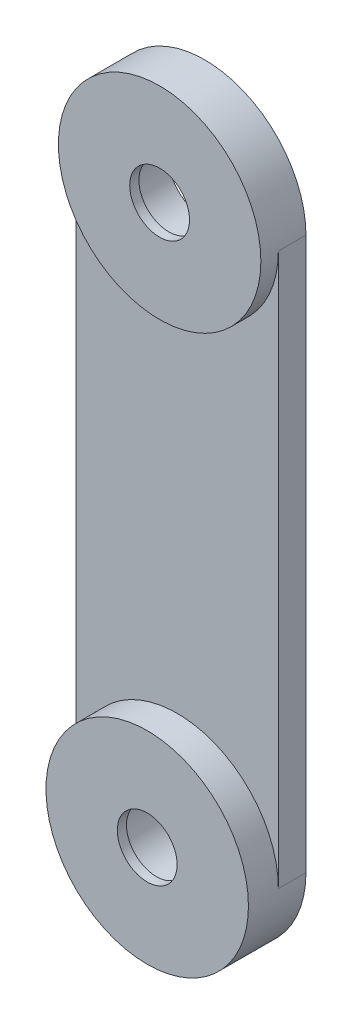
ISO-10303-21;
HEADER;
FILE_DESCRIPTION(('STEP AP214'),'2;1');
FILE_NAME('part.step','',(''),(''),'','','');
FILE_SCHEMA(('AUTOMOTIVE_DESIGN { 1 0 10303 214 1 1 1 1 }'));
ENDSEC;
DATA;
#1=APPLICATION_CONTEXT('core data for automotive mechanical design processes');
#2=APPLICATION_PROTOCOL_DEFINITION('international standard','automotive_design',2000,#1);
#3=PRODUCT_CONTEXT('',#1,'mechanical');
#4=PRODUCT('Part','Part','',(#3));
#5=PRODUCT_RELATED_PRODUCT_CATEGORY('part','',(#4));
#6=PRODUCT_DEFINITION_FORMATION('','',#4);
#7=PRODUCT_DEFINITION_CONTEXT('part definition',#1,'design');
#8=PRODUCT_DEFINITION('design','',#6,#7);
#9=PRODUCT_DEFINITION_SHAPE('','',#8);
#10=(LENGTH_UNIT() NAMED_UNIT(*) SI_UNIT(.MILLI.,.METRE.));
#11=(NAMED_UNIT(*) PLANE_ANGLE_UNIT() SI_UNIT($,.RADIAN.));
#12=(NAMED_UNIT(*) SI_UNIT($,.STERADIAN.) SOLID_ANGLE_UNIT());
#13=UNCERTAINTY_MEASURE_WITH_UNIT(LENGTH_MEASURE(1.E-05),#10,'distance_accuracy_value','');
#14=(GEOMETRIC_REPRESENTATION_CONTEXT(3) GLOBAL_UNCERTAINTY_ASSIGNED_CONTEXT((#13)) GLOBAL_UNIT_ASSIGNED_CONTEXT((#10,
#11,#12)) REPRESENTATION_CONTEXT('',''));
#15=CARTESIAN_POINT('',(0.,0.,0.));
#16=DIRECTION('',(0.,0.,1.));
#17=DIRECTION('',(1.,0.,0.));
#18=AXIS2_PLACEMENT_3D('',#15,#16,#17);
#19=CARTESIAN_POINT('',(13.3841875105118,-8.42748695585386,0.));
#20=DIRECTION('',(0.,0.,1.));
#21=DIRECTION('',(1.,0.,0.));
#22=AXIS2_PLACEMENT_3D('',#19,#20,#21);
#23=PLANE('',#22);
#24=CARTESIAN_POINT('',(13.3841875105117,-8.42748695585386,0.));
#25=DIRECTION('',(0.,0.,-1.));
#26=DIRECTION('',(-1.,0.,0.));
#27=AXIS2_PLACEMENT_3D('',#24,#25,#26);
#28=CIRCLE('',#27,3.25);
#29=CARTESIAN_POINT('',(10.1341875105117,-8.42748695585386,0.));
#30=VERTEX_POINT('',#29);
#31=EDGE_CURVE('E121',#30,#30,#28,.T.);
#32=ORIENTED_EDGE('',*,*,#31,.T.);
#33=EDGE_LOOP('',(#32));
#34=FACE_BOUND('',#33,.T.);
#35=CARTESIAN_POINT('',(13.3841875105118,-8.42748695585386,0.));
#36=DIRECTION('',(0.,0.,1.));
#37=DIRECTION('',(1.,0.,0.));
#38=AXIS2_PLACEMENT_3D('',#35,#36,#37);
#39=CIRCLE('',#38,11.);
#40=CARTESIAN_POINT('',(24.3841875105118,-8.42748695585386,0.));
#41=VERTEX_POINT('',#40);
#42=EDGE_CURVE('E46',#41,#41,#39,.T.);
#43=ORIENTED_EDGE('',*,*,#42,.T.);
#44=EDGE_LOOP('',(#43));
#45=FACE_BOUND('',#44,.T.);
#46=ADVANCED_FACE('F37',(#34,#45),#23,.T.);
#47=CARTESIAN_POINT('',(13.3841875105118,-8.42748695585386,-35.0126983722081));
#48=DIRECTION('',(0.,0.,1.));
#49=DIRECTION('',(1.,0.,0.));
#50=AXIS2_PLACEMENT_3D('',#47,#48,#49);
#51=CYLINDRICAL_SURFACE('',#50,11.);
#52=ORIENTED_EDGE('',*,*,#42,.F.);
#53=EDGE_LOOP('',(#52));
#54=FACE_BOUND('',#53,.T.);
#55=CARTESIAN_POINT('',(13.3841875105118,-8.42748695585386,-1.90000000000001));
#56=DIRECTION('',(0.,0.,-1.));
#57=DIRECTION('',(-1.,0.,0.));
#58=AXIS2_PLACEMENT_3D('',#55,#56,#57);
#59=CIRCLE('',#58,11.);
#60=CARTESIAN_POINT('',(2.38418751051177,-8.42748695585386,-1.90000000000001));
#61=VERTEX_POINT('',#60);
#62=CARTESIAN_POINT('',(24.3841875105118,-8.42748695585386,-1.90000000000001));
#63=VERTEX_POINT('',#62);
#64=EDGE_CURVE('E12',#61,#63,#59,.F.);
#65=ORIENTED_EDGE('',*,*,#64,.T.);
#66=DIRECTION('',(0.,0.,1.));
#67=VECTOR('',#66,1.);
#68=CARTESIAN_POINT('',(24.3841875105118,-8.42748695585386,-4.90000000000001));
#69=LINE('',#68,#67);
#70=CARTESIAN_POINT('',(24.3841875105118,-8.42748695585386,-4.90000000000001));
#71=VERTEX_POINT('',#70);
#72=EDGE_CURVE('E132',#71,#63,#69,.T.);
#73=ORIENTED_EDGE('',*,*,#72,.F.);
#74=CARTESIAN_POINT('',(13.3841875105118,-8.42748695585386,-4.90000000000001));
#75=DIRECTION('',(0.,0.,-1.));
#76=DIRECTION('',(-1.,0.,0.));
#77=AXIS2_PLACEMENT_3D('',#74,#75,#76);
#78=CIRCLE('',#77,11.);
#79=CARTESIAN_POINT('',(2.38418751051176,-8.42748695585386,-4.90000000000001));
#80=VERTEX_POINT('',#79);
#81=EDGE_CURVE('E91',#80,#71,#78,.T.);
#82=ORIENTED_EDGE('',*,*,#81,.F.);
#83=DIRECTION('',(0.,0.,1.));
#84=VECTOR('',#83,1.);
#85=CARTESIAN_POINT('',(2.38418751051176,-8.42748695585386,-4.90000000000001));
#86=LINE('',#85,#84);
#87=EDGE_CURVE('E53',#80,#61,#86,.T.);
#88=ORIENTED_EDGE('',*,*,#87,.T.);
#89=EDGE_LOOP('',(#65,#73,#82,#88));
#90=FACE_BOUND('',#89,.T.);
#91=ADVANCED_FACE('F39',(#54,#90),#51,.T.);
#92=CARTESIAN_POINT('',(24.3841875105118,-8.42748695585386,-4.90000000000001));
#93=DIRECTION('',(-1.,0.,0.));
#94=DIRECTION('',(0.,0.,1.));
#95=AXIS2_PLACEMENT_3D('',#92,#93,#94);
#96=PLANE('',#95);
#97=DIRECTION('',(0.,-1.,0.));
#98=VECTOR('',#97,1.);
#99=CARTESIAN_POINT('',(24.3841875105118,-8.42748695585386,-1.90000000000001));
#100=LINE('',#99,#98);
#101=CARTESIAN_POINT('',(24.3841875105118,-68.4274869558539,-1.90000000000001));
#102=VERTEX_POINT('',#101);
#103=EDGE_CURVE('E92',#63,#102,#100,.T.);
#104=ORIENTED_EDGE('',*,*,#103,.T.);
#105=DIRECTION('',(0.,0.,1.));
#106=VECTOR('',#105,1.);
#107=CARTESIAN_POINT('',(24.3841875105118,-68.4274869558539,-4.90000000000001));
#108=LINE('',#107,#106);
#109=CARTESIAN_POINT('',(24.3841875105118,-68.4274869558539,-4.90000000000001));
#110=VERTEX_POINT('',#109);
#111=EDGE_CURVE('E99',#110,#102,#108,.T.);
#112=ORIENTED_EDGE('',*,*,#111,.F.);
#113=DIRECTION('',(0.,-1.,0.));
#114=VECTOR('',#113,1.);
#115=CARTESIAN_POINT('',(24.3841875105118,-8.42748695585386,-4.90000000000001));
#116=LINE('',#115,#114);
#117=EDGE_CURVE('E84',#71,#110,#116,.T.);
#118=ORIENTED_EDGE('',*,*,#117,.F.);
#119=ORIENTED_EDGE('',*,*,#72,.T.);
#120=EDGE_LOOP('',(#104,#112,#118,#119));
#121=FACE_BOUND('',#120,.T.);
#122=ADVANCED_FACE('F159',(#121),#96,.F.);
#123=CARTESIAN_POINT('',(13.3841875105118,-68.4274869558539,-4.9));
#124=DIRECTION('',(0.,0.,1.));
#125=DIRECTION('',(1.,0.,0.));
#126=AXIS2_PLACEMENT_3D('',#123,#124,#125);
#127=CYLINDRICAL_SURFACE('',#126,11.);
#128=ORIENTED_EDGE('',*,*,#111,.T.);
#129=CARTESIAN_POINT('',(13.3841875105118,-68.4274869558539,-1.90000000000001));
#130=DIRECTION('',(0.,0.,1.));
#131=DIRECTION('',(1.,0.,0.));
#132=AXIS2_PLACEMENT_3D('',#129,#130,#131);
#133=CIRCLE('',#132,11.);
#134=CARTESIAN_POINT('',(2.38418751051177,-68.4274869558539,-1.90000000000001));
#135=VERTEX_POINT('',#134);
#136=EDGE_CURVE('E76',#102,#135,#133,.T.);
#137=ORIENTED_EDGE('',*,*,#136,.T.);
#138=DIRECTION('',(0.,0.,1.));
#139=VECTOR('',#138,1.);
#140=CARTESIAN_POINT('',(2.38418751051176,-68.4274869558539,-4.9));
#141=LINE('',#140,#139);
#142=CARTESIAN_POINT('',(2.38418751051176,-68.4274869558539,-4.9));
#143=VERTEX_POINT('',#142);
#144=EDGE_CURVE('E95',#143,#135,#141,.T.);
#145=ORIENTED_EDGE('',*,*,#144,.F.);
#146=CARTESIAN_POINT('',(13.3841875105118,-68.4274869558539,-4.9));
#147=DIRECTION('',(0.,0.,-1.));
#148=DIRECTION('',(-1.,0.,0.));
#149=AXIS2_PLACEMENT_3D('',#146,#147,#148);
#150=CIRCLE('',#149,11.);
#151=EDGE_CURVE('E126',#110,#143,#150,.T.);
#152=ORIENTED_EDGE('',*,*,#151,.F.);
#153=EDGE_LOOP('',(#128,#137,#145,#152));
#154=FACE_BOUND('',#153,.T.);
#155=CARTESIAN_POINT('',(13.3841875105118,-68.4274869558539,1.35000000000002));
#156=DIRECTION('',(0.,0.,1.));
#157=DIRECTION('',(0.,-1.,0.));
#158=AXIS2_PLACEMENT_3D('',#155,#156,#157);
#159=CIRCLE('',#158,11.);
#160=CARTESIAN_POINT('',(13.3841875105118,-79.4274869558539,1.35000000000002));
#161=VERTEX_POINT('',#160);
#162=EDGE_CURVE('E104',#161,#161,#159,.T.);
#163=ORIENTED_EDGE('',*,*,#162,.F.);
#164=EDGE_LOOP('',(#163));
#165=FACE_BOUND('',#164,.T.);
#166=ADVANCED_FACE('F102',(#154,#165),#127,.T.);
#167=CARTESIAN_POINT('',(2.38418751051176,-8.42748695585386,-4.90000000000001));
#168=DIRECTION('',(1.,0.,0.));
#169=DIRECTION('',(0.,0.,-1.));
#170=AXIS2_PLACEMENT_3D('',#167,#168,#169);
#171=PLANE('',#170);
#172=DIRECTION('',(0.,1.,0.));
#173=VECTOR('',#172,1.);
#174=CARTESIAN_POINT('',(2.38418751051177,-8.42748695585386,-1.90000000000001));
#175=LINE('',#174,#173);
#176=EDGE_CURVE('E87',#135,#61,#175,.T.);
#177=ORIENTED_EDGE('',*,*,#176,.T.);
#178=ORIENTED_EDGE('',*,*,#87,.F.);
#179=DIRECTION('',(0.,1.,0.));
#180=VECTOR('',#179,1.);
#181=CARTESIAN_POINT('',(2.38418751051176,-8.42748695585386,-4.90000000000001));
#182=LINE('',#181,#180);
#183=EDGE_CURVE('E62',#143,#80,#182,.T.);
#184=ORIENTED_EDGE('',*,*,#183,.F.);
#185=ORIENTED_EDGE('',*,*,#144,.T.);
#186=EDGE_LOOP('',(#177,#178,#184,#185));
#187=FACE_BOUND('',#186,.T.);
#188=ADVANCED_FACE('F96',(#187),#171,.F.);
#189=CARTESIAN_POINT('',(13.3841875105118,-8.42748695585386,-4.90000000000001));
#190=DIRECTION('',(0.,0.,-1.));
#191=DIRECTION('',(-1.,0.,0.));
#192=AXIS2_PLACEMENT_3D('',#189,#190,#191);
#193=PLANE('',#192);
#194=CARTESIAN_POINT('',(13.3841875105117,-68.4274869558537,-4.9));
#195=DIRECTION('',(0.,0.,-1.));
#196=DIRECTION('',(-1.,0.,0.));
#197=AXIS2_PLACEMENT_3D('',#194,#195,#196);
#198=CIRCLE('',#197,4.00000000000001);
#199=CARTESIAN_POINT('',(9.38418751051166,-68.4274869558537,-4.9));
#200=VERTEX_POINT('',#199);
#201=EDGE_CURVE('E111',#200,#200,#198,.T.);
#202=ORIENTED_EDGE('',*,*,#201,.F.);
#203=EDGE_LOOP('',(#202));
#204=FACE_BOUND('',#203,.T.);
#205=CARTESIAN_POINT('',(13.3841875105117,-8.42748695585386,-4.90000000000001));
#206=DIRECTION('',(0.,0.,-1.));
#207=DIRECTION('',(-1.,0.,0.));
#208=AXIS2_PLACEMENT_3D('',#205,#206,#207);
#209=CIRCLE('',#208,4.);
#210=CARTESIAN_POINT('',(9.38418751051175,-8.42748695585386,-4.90000000000001));
#211=VERTEX_POINT('',#210);
#212=EDGE_CURVE('E108',#211,#211,#209,.T.);
#213=ORIENTED_EDGE('',*,*,#212,.F.);
#214=EDGE_LOOP('',(#213));
#215=FACE_BOUND('',#214,.T.);
#216=ORIENTED_EDGE('',*,*,#81,.T.);
#217=ORIENTED_EDGE('',*,*,#117,.T.);
#218=ORIENTED_EDGE('',*,*,#151,.T.);
#219=ORIENTED_EDGE('',*,*,#183,.T.);
#220=EDGE_LOOP('',(#216,#217,#218,#219));
#221=FACE_BOUND('',#220,.T.);
#222=ADVANCED_FACE('F169',(#204,#215,#221),#193,.T.);
#223=CARTESIAN_POINT('',(13.3841875105118,-8.42748695585386,-1.90000000000001));
#224=DIRECTION('',(0.,0.,-1.));
#225=DIRECTION('',(-1.,0.,0.));
#226=AXIS2_PLACEMENT_3D('',#223,#224,#225);
#227=PLANE('',#226);
#228=ORIENTED_EDGE('',*,*,#136,.F.);
#229=ORIENTED_EDGE('',*,*,#103,.F.);
#230=ORIENTED_EDGE('',*,*,#64,.F.);
#231=ORIENTED_EDGE('',*,*,#176,.F.);
#232=EDGE_LOOP('',(#228,#229,#230,#231));
#233=FACE_BOUND('',#232,.T.);
#234=ADVANCED_FACE('F89',(#233),#227,.F.);
#235=CARTESIAN_POINT('',(13.3841875105117,-8.42748695585386,0.));
#236=DIRECTION('',(0.,0.,-1.));
#237=DIRECTION('',(-1.,0.,0.));
#238=AXIS2_PLACEMENT_3D('',#235,#236,#237);
#239=CYLINDRICAL_SURFACE('',#238,3.25);
#240=CARTESIAN_POINT('',(13.3841875105117,-8.42748695585386,-1.));
#241=DIRECTION('',(0.,0.,1.));
#242=DIRECTION('',(1.,0.,0.));
#243=AXIS2_PLACEMENT_3D('',#240,#241,#242);
#244=CIRCLE('',#243,3.25);
#245=CARTESIAN_POINT('',(10.1341875105117,-8.42748695585386,-1.));
#246=VERTEX_POINT('',#245);
#247=EDGE_CURVE('E120',#246,#246,#244,.F.);
#248=CARTESIAN_POINT('',(10.1341875105117,-8.42748695585386,-1.));
#249=CARTESIAN_POINT('',(10.1341875105117,-8.42748695585386,-0.989583333333333));
#250=CARTESIAN_POINT('',(10.1341875105117,-8.42748695585386,-0.979166666666667));
#251=CARTESIAN_POINT('',(10.1341875105117,-8.42748695585386,-0.958333333333333));
#252=CARTESIAN_POINT('',(10.1341875105117,-8.42748695585386,-0.947916666666667));
#253=CARTESIAN_POINT('',(10.1341875105117,-8.42748695585386,-0.927083333333333));
#254=CARTESIAN_POINT('',(10.1341875105117,-8.42748695585386,-0.916666666666666));
#255=CARTESIAN_POINT('',(10.1341875105117,-8.42748695585386,-0.895833333333333));
#256=CARTESIAN_POINT('',(10.1341875105117,-8.42748695585386,-0.885416666666666));
#257=CARTESIAN_POINT('',(10.1341875105117,-8.42748695585386,-0.864583333333333));
#258=CARTESIAN_POINT('',(10.1341875105117,-8.42748695585386,-0.854166666666666));
#259=CARTESIAN_POINT('',(10.1341875105117,-8.42748695585386,-0.833333333333332));
#260=CARTESIAN_POINT('',(10.1341875105117,-8.42748695585386,-0.822916666666666));
#261=CARTESIAN_POINT('',(10.1341875105117,-8.42748695585386,-0.802083333333332));
#262=CARTESIAN_POINT('',(10.1341875105117,-8.42748695585386,-0.791666666666665));
#263=CARTESIAN_POINT('',(10.1341875105117,-8.42748695585386,-0.770833333333332));
#264=CARTESIAN_POINT('',(10.1341875105117,-8.42748695585386,-0.760416666666665));
#265=CARTESIAN_POINT('',(10.1341875105117,-8.42748695585386,-0.739583333333332));
#266=CARTESIAN_POINT('',(10.1341875105117,-8.42748695585386,-0.729166666666665));
#267=CARTESIAN_POINT('',(10.1341875105117,-8.42748695585386,-0.708333333333332));
#268=CARTESIAN_POINT('',(10.1341875105117,-8.42748695585386,-0.697916666666665));
#269=CARTESIAN_POINT('',(10.1341875105117,-8.42748695585386,-0.677083333333331));
#270=CARTESIAN_POINT('',(10.1341875105117,-8.42748695585386,-0.666666666666665));
#271=CARTESIAN_POINT('',(10.1341875105117,-8.42748695585386,-0.645833333333331));
#272=CARTESIAN_POINT('',(10.1341875105117,-8.42748695585386,-0.635416666666664));
#273=CARTESIAN_POINT('',(10.1341875105117,-8.42748695585386,-0.614583333333331));
#274=CARTESIAN_POINT('',(10.1341875105117,-8.42748695585386,-0.604166666666664));
#275=CARTESIAN_POINT('',(10.1341875105117,-8.42748695585386,-0.583333333333331));
#276=CARTESIAN_POINT('',(10.1341875105117,-8.42748695585386,-0.572916666666664));
#277=CARTESIAN_POINT('',(10.1341875105117,-8.42748695585386,-0.552083333333331));
#278=CARTESIAN_POINT('',(10.1341875105117,-8.42748695585386,-0.541666666666664));
#279=CARTESIAN_POINT('',(10.1341875105117,-8.42748695585386,-0.52083333333333));
#280=CARTESIAN_POINT('',(10.1341875105117,-8.42748695585386,-0.510416666666664));
#281=CARTESIAN_POINT('',(10.1341875105117,-8.42748695585386,-0.48958333333333));
#282=CARTESIAN_POINT('',(10.1341875105117,-8.42748695585386,-0.479166666666664));
#283=CARTESIAN_POINT('',(10.1341875105117,-8.42748695585386,-0.45833333333333));
#284=CARTESIAN_POINT('',(10.1341875105117,-8.42748695585386,-0.447916666666663));
#285=CARTESIAN_POINT('',(10.1341875105117,-8.42748695585386,-0.42708333333333));
#286=CARTESIAN_POINT('',(10.1341875105117,-8.42748695585386,-0.416666666666663));
#287=CARTESIAN_POINT('',(10.1341875105117,-8.42748695585386,-0.39583333333333));
#288=CARTESIAN_POINT('',(10.1341875105117,-8.42748695585386,-0.385416666666663));
#289=CARTESIAN_POINT('',(10.1341875105117,-8.42748695585386,-0.364583333333329));
#290=CARTESIAN_POINT('',(10.1341875105117,-8.42748695585386,-0.354166666666663));
#291=CARTESIAN_POINT('',(10.1341875105117,-8.42748695585386,-0.333333333333329));
#292=CARTESIAN_POINT('',(10.1341875105117,-8.42748695585386,-0.322916666666663));
#293=CARTESIAN_POINT('',(10.1341875105117,-8.42748695585386,-0.302083333333329));
#294=CARTESIAN_POINT('',(10.1341875105117,-8.42748695585386,-0.291666666666662));
#295=CARTESIAN_POINT('',(10.1341875105117,-8.42748695585386,-0.270833333333329));
#296=CARTESIAN_POINT('',(10.1341875105117,-8.42748695585386,-0.260416666666662));
#297=CARTESIAN_POINT('',(10.1341875105117,-8.42748695585386,-0.239583333333329));
#298=CARTESIAN_POINT('',(10.1341875105117,-8.42748695585386,-0.229166666666662));
#299=CARTESIAN_POINT('',(10.1341875105117,-8.42748695585386,-0.208333333333328));
#300=CARTESIAN_POINT('',(10.1341875105117,-8.42748695585386,-0.197916666666662));
#301=CARTESIAN_POINT('',(10.1341875105117,-8.42748695585386,-0.177083333333328));
#302=CARTESIAN_POINT('',(10.1341875105117,-8.42748695585386,-0.166666666666662));
#303=CARTESIAN_POINT('',(10.1341875105117,-8.42748695585386,-0.145833333333328));
#304=CARTESIAN_POINT('',(10.1341875105117,-8.42748695585386,-0.135416666666661));
#305=CARTESIAN_POINT('',(10.1341875105117,-8.42748695585386,-0.114583333333328));
#306=CARTESIAN_POINT('',(10.1341875105117,-8.42748695585386,-0.104166666666661));
#307=CARTESIAN_POINT('',(10.1341875105117,-8.42748695585386,-0.0833333333333277));
#308=CARTESIAN_POINT('',(10.1341875105117,-8.42748695585386,-0.0729166666666609));
#309=CARTESIAN_POINT('',(10.1341875105117,-8.42748695585386,-0.0520833333333275));
#310=CARTESIAN_POINT('',(10.1341875105117,-8.42748695585386,-0.0416666666666608));
#311=CARTESIAN_POINT('',(10.1341875105117,-8.42748695585386,-0.0208333333333273));
#312=CARTESIAN_POINT('',(10.1341875105117,-8.42748695585386,-0.0104166666666605));
#313=CARTESIAN_POINT('',(10.1341875105117,-8.42748695585386,0.));
#314=B_SPLINE_CURVE_WITH_KNOTS('',3,(#248,#249,#250,#251,#252,#253,#254,#255,#256,#257,#258,
#259,#260,#261,#262,#263,#264,#265,#266,#267,#268,#269,#270,#271,#272,#273,#274,#275,#276,#277,
#278,#279,#280,#281,#282,#283,#284,#285,#286,#287,#288,#289,#290,#291,#292,#293,#294,#295,#296,
#297,#298,#299,#300,#301,#302,#303,#304,#305,#306,#307,#308,#309,#310,#311,#312,#313),
.UNSPECIFIED.,.F.,.F.,(4,2,2,2,2,2,2,2,2,2,2,2,2,2,2,2,2,2,2,2,2,2,2,2,2,2,2,2,2,2,2,2,4),(0.,
0.03125,0.0625000000000002,0.0937500000000004,0.125000000000001,0.156250000000001,
0.187500000000001,0.218750000000001,0.250000000000001,0.281250000000002,0.312500000000002,
0.343750000000002,0.375000000000002,0.406250000000002,0.437500000000003,0.468750000000003,
0.500000000000003,0.531250000000003,0.562500000000003,0.593750000000004,0.625000000000004,
0.656250000000004,0.687500000000004,0.718750000000004,0.750000000000005,0.781250000000005,
0.812500000000005,0.843750000000005,0.875000000000006,0.906250000000006,0.937500000000006,
0.968750000000006,1.00000000000001),.UNSPECIFIED.);
#315=EDGE_CURVE('BSEAM138',#246,#30,#314,.T.);
#316=ORIENTED_EDGE('',*,*,#247,.T.);
#317=ORIENTED_EDGE('',*,*,#31,.F.);
#318=ORIENTED_EDGE('',*,*,#315,.T.);
#319=ORIENTED_EDGE('',*,*,#315,.F.);
#320=EDGE_LOOP('',(#316,#318,#317,#319));
#321=FACE_BOUND('',#320,.T.);
#322=ADVANCED_FACE('F138',(#321),#239,.F.);
#323=CARTESIAN_POINT('',(13.3841875105118,-8.42748695585386,-1.));
#324=DIRECTION('',(0.,0.,1.));
#325=DIRECTION('',(1.,0.,0.));
#326=AXIS2_PLACEMENT_3D('',#323,#324,#325);
#327=PLANE('',#326);
#328=CARTESIAN_POINT('',(13.3841875105117,-8.42748695585386,-1.));
#329=DIRECTION('',(0.,0.,1.));
#330=DIRECTION('',(1.,0.,0.));
#331=AXIS2_PLACEMENT_3D('',#328,#329,#330);
#332=CIRCLE('',#331,4.);
#333=CARTESIAN_POINT('',(17.3841875105118,-8.42748695585386,-1.));
#334=VERTEX_POINT('',#333);
#335=EDGE_CURVE('E117',#334,#334,#332,.F.);
#336=ORIENTED_EDGE('',*,*,#335,.T.);
#337=EDGE_LOOP('',(#336));
#338=FACE_BOUND('',#337,.T.);
#339=ORIENTED_EDGE('',*,*,#247,.F.);
#340=EDGE_LOOP('',(#339));
#341=FACE_BOUND('',#340,.T.);
#342=ADVANCED_FACE('F141',(#338,#341),#327,.F.);
#343=CARTESIAN_POINT('',(13.3841875105118,-8.42748695585386,11.3137084989848));
#344=DIRECTION('',(0.,0.,-1.));
#345=DIRECTION('',(-1.,0.,0.));
#346=AXIS2_PLACEMENT_3D('',#343,#344,#345);
#347=CYLINDRICAL_SURFACE('',#346,4.);
#348=ORIENTED_EDGE('',*,*,#212,.T.);
#349=EDGE_LOOP('',(#348));
#350=FACE_BOUND('',#349,.T.);
#351=ORIENTED_EDGE('',*,*,#335,.F.);
#352=EDGE_LOOP('',(#351));
#353=FACE_BOUND('',#352,.T.);
#354=ADVANCED_FACE('F143',(#350,#353),#347,.F.);
#355=CARTESIAN_POINT('',(17.2223856458588,-68.1262643242046,1.35000000000002));
#356=DIRECTION('',(0.,0.,1.));
#357=DIRECTION('',(0.0782396445841863,-0.996934580609651,0.));
#358=AXIS2_PLACEMENT_3D('',#355,#356,#357);
#359=PLANE('',#358);
#360=CARTESIAN_POINT('',(13.3841875105117,-68.4274869558537,1.35000000000003));
#361=DIRECTION('',(0.,0.,-1.));
#362=DIRECTION('',(-1.,0.,0.));
#363=AXIS2_PLACEMENT_3D('',#360,#361,#362);
#364=CIRCLE('',#363,3.25);
#365=CARTESIAN_POINT('',(10.1341875105117,-68.4274869558537,1.35000000000003));
#366=VERTEX_POINT('',#365);
#367=EDGE_CURVE('E185',#366,#366,#364,.T.);
#368=ORIENTED_EDGE('',*,*,#367,.T.);
#369=EDGE_LOOP('',(#368));
#370=FACE_BOUND('',#369,.T.);
#371=ORIENTED_EDGE('',*,*,#162,.T.);
#372=EDGE_LOOP('',(#371));
#373=FACE_BOUND('',#372,.T.);
#374=ADVANCED_FACE('F150',(#370,#373),#359,.T.);
#375=CARTESIAN_POINT('',(17.2223856458588,-68.1262643242046,0.350000000000018));
#376=DIRECTION('',(0.,0.,1.));
#377=DIRECTION('',(0.0782396445841863,-0.996934580609651,0.));
#378=AXIS2_PLACEMENT_3D('',#375,#376,#377);
#379=PLANE('',#378);
#380=CARTESIAN_POINT('',(13.3841875105117,-68.4274869558537,0.350000000000019));
#381=DIRECTION('',(0.,0.,1.));
#382=DIRECTION('',(0.,-1.,0.));
#383=AXIS2_PLACEMENT_3D('',#380,#381,#382);
#384=CIRCLE('',#383,3.25);
#385=CARTESIAN_POINT('',(13.3841875105117,-71.6774869558537,0.350000000000019));
#386=VERTEX_POINT('',#385);
#387=EDGE_CURVE('E41',#386,#386,#384,.T.);
#388=ORIENTED_EDGE('',*,*,#387,.T.);
#389=EDGE_LOOP('',(#388));
#390=FACE_BOUND('',#389,.T.);
#391=CARTESIAN_POINT('',(13.3841875105117,-68.4274869558537,0.350000000000019));
#392=DIRECTION('',(0.,0.,1.));
#393=DIRECTION('',(0.,-1.,0.));
#394=AXIS2_PLACEMENT_3D('',#391,#392,#393);
#395=CIRCLE('',#394,4.00000000000001);
#396=CARTESIAN_POINT('',(13.3841875105117,-72.4274869558537,0.35000000000002));
#397=VERTEX_POINT('',#396);
#398=EDGE_CURVE('E105',#397,#397,#395,.F.);
#399=ORIENTED_EDGE('',*,*,#398,.T.);
#400=EDGE_LOOP('',(#399));
#401=FACE_BOUND('',#400,.T.);
#402=ADVANCED_FACE('F199',(#390,#401),#379,.F.);
#403=CARTESIAN_POINT('',(13.3841875105117,-68.4274869558537,12.6637084989848));
#404=DIRECTION('',(0.,0.,-1.));
#405=DIRECTION('',(-1.,0.,0.));
#406=AXIS2_PLACEMENT_3D('',#403,#404,#405);
#407=CYLINDRICAL_SURFACE('',#406,4.00000000000001);
#408=ORIENTED_EDGE('',*,*,#201,.T.);
#409=EDGE_LOOP('',(#408));
#410=FACE_BOUND('',#409,.T.);
#411=ORIENTED_EDGE('',*,*,#398,.F.);
#412=EDGE_LOOP('',(#411));
#413=FACE_BOUND('',#412,.T.);
#414=ADVANCED_FACE('F195',(#410,#413),#407,.F.);
#415=CARTESIAN_POINT('',(13.3841875105117,-68.4274869558537,1.35000000000003));
#416=DIRECTION('',(0.,0.,-1.));
#417=DIRECTION('',(-1.,0.,0.));
#418=AXIS2_PLACEMENT_3D('',#415,#416,#417);
#419=CYLINDRICAL_SURFACE('',#418,3.25);
#420=ORIENTED_EDGE('',*,*,#367,.F.);
#421=EDGE_LOOP('',(#420));
#422=FACE_BOUND('',#421,.T.);
#423=ORIENTED_EDGE('',*,*,#387,.F.);
#424=EDGE_LOOP('',(#423));
#425=FACE_BOUND('',#424,.T.);
#426=ADVANCED_FACE('F192',(#422,#425),#419,.F.);
#427=CLOSED_SHELL('',(#46,#91,#122,#166,#188,#222,#234,#322,#342,#354,#374,#402,#414,#426));
#428=MANIFOLD_SOLID_BREP('B2',#427);
#429=ADVANCED_BREP_SHAPE_REPRESENTATION('',(#18,#428),#14);
#430=SHAPE_DEFINITION_REPRESENTATION(#9,#429);
ENDSEC;
END-ISO-10303-21;
